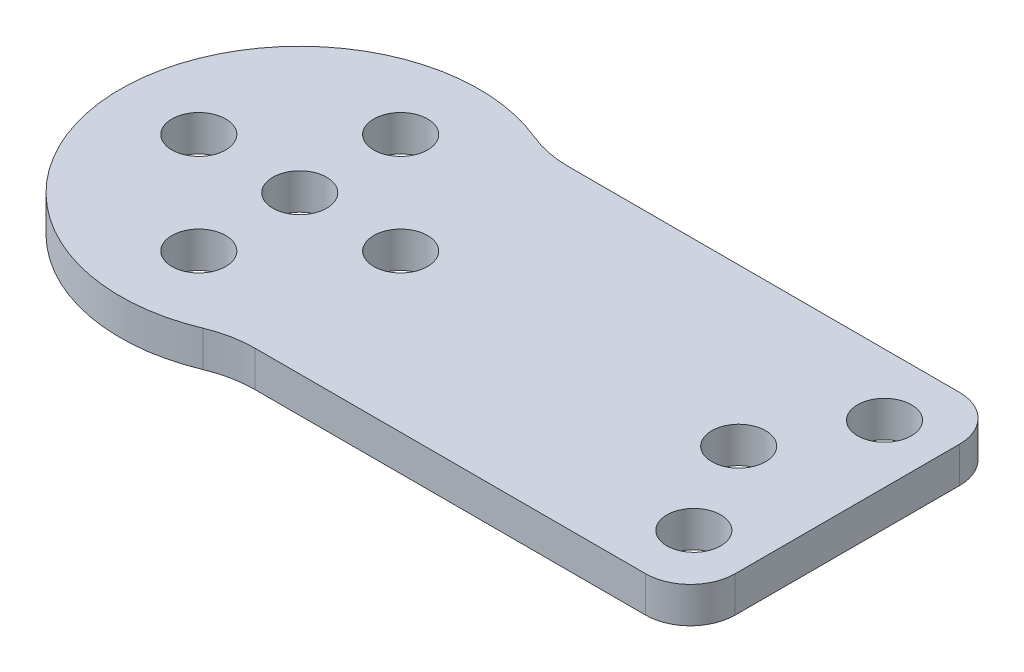
ISO-10303-21;
HEADER;
FILE_DESCRIPTION(('STEP AP214'),'2;1');
FILE_NAME('part.step','',(''),(''),'','','');
FILE_SCHEMA(('AUTOMOTIVE_DESIGN { 1 0 10303 214 1 1 1 1 }'));
ENDSEC;
DATA;
#1=APPLICATION_CONTEXT('core data for automotive mechanical design processes');
#2=APPLICATION_PROTOCOL_DEFINITION('international standard','automotive_design',2000,#1);
#3=PRODUCT_CONTEXT('',#1,'mechanical');
#4=PRODUCT('Part','Part','',(#3));
#5=PRODUCT_RELATED_PRODUCT_CATEGORY('part','',(#4));
#6=PRODUCT_DEFINITION_FORMATION('','',#4);
#7=PRODUCT_DEFINITION_CONTEXT('part definition',#1,'design');
#8=PRODUCT_DEFINITION('design','',#6,#7);
#9=PRODUCT_DEFINITION_SHAPE('','',#8);
#10=(LENGTH_UNIT() NAMED_UNIT(*) SI_UNIT(.MILLI.,.METRE.));
#11=(NAMED_UNIT(*) PLANE_ANGLE_UNIT() SI_UNIT($,.RADIAN.));
#12=(NAMED_UNIT(*) SI_UNIT($,.STERADIAN.) SOLID_ANGLE_UNIT());
#13=UNCERTAINTY_MEASURE_WITH_UNIT(LENGTH_MEASURE(1.E-05),#10,'distance_accuracy_value','');
#14=(GEOMETRIC_REPRESENTATION_CONTEXT(3) GLOBAL_UNCERTAINTY_ASSIGNED_CONTEXT((#13)) GLOBAL_UNIT_ASSIGNED_CONTEXT((#10,
#11,#12)) REPRESENTATION_CONTEXT('',''));
#15=CARTESIAN_POINT('',(0.,0.,0.));
#16=DIRECTION('',(0.,0.,1.));
#17=DIRECTION('',(1.,0.,0.));
#18=AXIS2_PLACEMENT_3D('',#15,#16,#17);
#19=CARTESIAN_POINT('',(11.716387939251,0.8,7.));
#20=DIRECTION('',(-1.,0.,0.));
#21=DIRECTION('',(0.,0.,1.));
#22=AXIS2_PLACEMENT_3D('',#19,#20,#21);
#23=PLANE('',#22);
#24=DIRECTION('',(0.,0.,-1.));
#25=VECTOR('',#24,1.);
#26=CARTESIAN_POINT('',(11.716387939251,-0.8,7.));
#27=LINE('',#26,#25);
#28=CARTESIAN_POINT('',(11.716387939251,-0.8,5.));
#29=VERTEX_POINT('',#28);
#30=CARTESIAN_POINT('',(11.716387939251,-0.8,-5.));
#31=VERTEX_POINT('',#30);
#32=EDGE_CURVE('E123',#29,#31,#27,.T.);
#33=ORIENTED_EDGE('',*,*,#32,.T.);
#34=DIRECTION('',(0.,-1.,0.));
#35=VECTOR('',#34,1.);
#36=CARTESIAN_POINT('',(11.716387939251,0.8,-5.));
#37=LINE('',#36,#35);
#38=CARTESIAN_POINT('',(11.716387939251,0.8,-5.));
#39=VERTEX_POINT('',#38);
#40=EDGE_CURVE('E101',#31,#39,#37,.F.);
#41=ORIENTED_EDGE('',*,*,#40,.T.);
#42=DIRECTION('',(0.,0.,-1.));
#43=VECTOR('',#42,1.);
#44=CARTESIAN_POINT('',(11.716387939251,0.8,7.));
#45=LINE('',#44,#43);
#46=CARTESIAN_POINT('',(11.716387939251,0.8,5.));
#47=VERTEX_POINT('',#46);
#48=EDGE_CURVE('E132',#47,#39,#45,.T.);
#49=ORIENTED_EDGE('',*,*,#48,.F.);
#50=DIRECTION('',(0.,-1.,0.));
#51=VECTOR('',#50,1.);
#52=CARTESIAN_POINT('',(11.716387939251,0.8,5.));
#53=LINE('',#52,#51);
#54=EDGE_CURVE('E106',#47,#29,#53,.T.);
#55=ORIENTED_EDGE('',*,*,#54,.T.);
#56=EDGE_LOOP('',(#33,#41,#49,#55));
#57=FACE_BOUND('',#56,.T.);
#58=ADVANCED_FACE('F32',(#57),#23,.F.);
#59=CARTESIAN_POINT('',(11.716387939251,0.8,-7.));
#60=DIRECTION('',(0.,0.,1.));
#61=DIRECTION('',(1.,0.,0.));
#62=AXIS2_PLACEMENT_3D('',#59,#60,#61);
#63=PLANE('',#62);
#64=DIRECTION('',(-1.,0.,0.));
#65=VECTOR('',#64,1.);
#66=CARTESIAN_POINT('',(11.716387939251,-0.8,-7.));
#67=LINE('',#66,#65);
#68=CARTESIAN_POINT('',(9.71638793925096,-0.8,-7.));
#69=VERTEX_POINT('',#68);
#70=CARTESIAN_POINT('',(-7.7,-0.8,-7.));
#71=VERTEX_POINT('',#70);
#72=EDGE_CURVE('E113',#69,#71,#67,.T.);
#73=ORIENTED_EDGE('',*,*,#72,.T.);
#74=DIRECTION('',(0.,1.,0.));
#75=VECTOR('',#74,1.);
#76=CARTESIAN_POINT('',(-7.7,0.8,-7.));
#77=LINE('',#76,#75);
#78=CARTESIAN_POINT('',(-7.7,0.8,-7.));
#79=VERTEX_POINT('',#78);
#80=EDGE_CURVE('E151',#71,#79,#77,.T.);
#81=ORIENTED_EDGE('',*,*,#80,.T.);
#82=DIRECTION('',(-1.,0.,0.));
#83=VECTOR('',#82,1.);
#84=CARTESIAN_POINT('',(11.716387939251,0.8,-7.));
#85=LINE('',#84,#83);
#86=CARTESIAN_POINT('',(9.71638793925096,0.8,-7.));
#87=VERTEX_POINT('',#86);
#88=EDGE_CURVE('E116',#87,#79,#85,.T.);
#89=ORIENTED_EDGE('',*,*,#88,.F.);
#90=DIRECTION('',(0.,-1.,0.));
#91=VECTOR('',#90,1.);
#92=CARTESIAN_POINT('',(9.71638793925096,0.8,-7.));
#93=LINE('',#92,#91);
#94=EDGE_CURVE('E100',#87,#69,#93,.T.);
#95=ORIENTED_EDGE('',*,*,#94,.T.);
#96=EDGE_LOOP('',(#73,#81,#89,#95));
#97=FACE_BOUND('',#96,.T.);
#98=ADVANCED_FACE('F112',(#97),#63,.F.);
#99=CARTESIAN_POINT('',(-12.7,0.8,0.));
#100=DIRECTION('',(0.,-1.,0.));
#101=DIRECTION('',(0.,0.,-1.));
#102=AXIS2_PLACEMENT_3D('',#99,#100,#101);
#103=CYLINDRICAL_SURFACE('',#102,8.);
#104=CARTESIAN_POINT('',(-12.7,0.8,0.));
#105=DIRECTION('',(0.,1.,0.));
#106=DIRECTION('',(0.,0.,1.));
#107=AXIS2_PLACEMENT_3D('',#104,#105,#106);
#108=CIRCLE('',#107,8.);
#109=CARTESIAN_POINT('',(-9.62307692307692,0.8,-7.38461538461539));
#110=VERTEX_POINT('',#109);
#111=CARTESIAN_POINT('',(-9.62307692307694,0.8,7.38461538461538));
#112=VERTEX_POINT('',#111);
#113=EDGE_CURVE('E166',#110,#112,#108,.T.);
#114=ORIENTED_EDGE('',*,*,#113,.F.);
#115=DIRECTION('',(0.,-1.,0.));
#116=VECTOR('',#115,1.);
#117=CARTESIAN_POINT('',(-9.62307692307692,0.8,-7.38461538461539));
#118=LINE('',#117,#116);
#119=CARTESIAN_POINT('',(-9.62307692307692,-0.8,-7.38461538461539));
#120=VERTEX_POINT('',#119);
#121=EDGE_CURVE('E148',#110,#120,#118,.T.);
#122=ORIENTED_EDGE('',*,*,#121,.T.);
#123=CARTESIAN_POINT('',(-12.7,-0.8,0.));
#124=DIRECTION('',(0.,1.,0.));
#125=DIRECTION('',(0.,0.,1.));
#126=AXIS2_PLACEMENT_3D('',#123,#124,#125);
#127=CIRCLE('',#126,8.);
#128=CARTESIAN_POINT('',(-9.62307692307694,-0.8,7.38461538461538));
#129=VERTEX_POINT('',#128);
#130=EDGE_CURVE('E122',#120,#129,#127,.T.);
#131=ORIENTED_EDGE('',*,*,#130,.T.);
#132=DIRECTION('',(0.,-1.,0.));
#133=VECTOR('',#132,1.);
#134=CARTESIAN_POINT('',(-9.62307692307694,0.8,7.38461538461538));
#135=LINE('',#134,#133);
#136=EDGE_CURVE('E146',#129,#112,#135,.F.);
#137=ORIENTED_EDGE('',*,*,#136,.T.);
#138=EDGE_LOOP('',(#114,#122,#131,#137));
#139=FACE_BOUND('',#138,.T.);
#140=ADVANCED_FACE('F160',(#139),#103,.T.);
#141=CARTESIAN_POINT('',(-8.8270166537926,0.8,7.));
#142=DIRECTION('',(0.,0.,-1.));
#143=DIRECTION('',(-1.,0.,0.));
#144=AXIS2_PLACEMENT_3D('',#141,#142,#143);
#145=PLANE('',#144);
#146=DIRECTION('',(1.,0.,0.));
#147=VECTOR('',#146,1.);
#148=CARTESIAN_POINT('',(-8.8270166537926,0.8,7.));
#149=LINE('',#148,#147);
#150=CARTESIAN_POINT('',(-7.70000000000002,0.8,7.));
#151=VERTEX_POINT('',#150);
#152=CARTESIAN_POINT('',(9.71638793925096,0.8,7.));
#153=VERTEX_POINT('',#152);
#154=EDGE_CURVE('E117',#151,#153,#149,.T.);
#155=ORIENTED_EDGE('',*,*,#154,.F.);
#156=DIRECTION('',(0.,1.,0.));
#157=VECTOR('',#156,1.);
#158=CARTESIAN_POINT('',(-7.70000000000002,-0.8,7.));
#159=LINE('',#158,#157);
#160=CARTESIAN_POINT('',(-7.70000000000002,-0.8,7.));
#161=VERTEX_POINT('',#160);
#162=EDGE_CURVE('E153',#151,#161,#159,.F.);
#163=ORIENTED_EDGE('',*,*,#162,.T.);
#164=DIRECTION('',(1.,0.,0.));
#165=VECTOR('',#164,1.);
#166=CARTESIAN_POINT('',(-8.8270166537926,-0.8,7.));
#167=LINE('',#166,#165);
#168=CARTESIAN_POINT('',(9.71638793925096,-0.8,7.));
#169=VERTEX_POINT('',#168);
#170=EDGE_CURVE('E126',#161,#169,#167,.T.);
#171=ORIENTED_EDGE('',*,*,#170,.T.);
#172=DIRECTION('',(0.,-1.,0.));
#173=VECTOR('',#172,1.);
#174=CARTESIAN_POINT('',(9.71638793925096,0.8,7.));
#175=LINE('',#174,#173);
#176=EDGE_CURVE('E143',#169,#153,#175,.F.);
#177=ORIENTED_EDGE('',*,*,#176,.T.);
#178=EDGE_LOOP('',(#155,#163,#171,#177));
#179=FACE_BOUND('',#178,.T.);
#180=ADVANCED_FACE('F163',(#179),#145,.F.);
#181=CARTESIAN_POINT('',(-12.7,0.8,0.));
#182=DIRECTION('',(0.,1.,0.));
#183=DIRECTION('',(0.,0.,1.));
#184=AXIS2_PLACEMENT_3D('',#181,#182,#183);
#185=PLANE('',#184);
#186=CARTESIAN_POINT('',(9.12138793925096,0.8,-4.25));
#187=DIRECTION('',(0.,1.,0.));
#188=DIRECTION('',(0.,0.,1.));
#189=AXIS2_PLACEMENT_3D('',#186,#187,#188);
#190=CIRCLE('',#189,1.2);
#191=CARTESIAN_POINT('',(9.12138793925096,0.8,-3.05));
#192=VERTEX_POINT('',#191);
#193=EDGE_CURVE('E214',#192,#192,#190,.T.);
#194=ORIENTED_EDGE('',*,*,#193,.F.);
#195=EDGE_LOOP('',(#194));
#196=FACE_BOUND('',#195,.T.);
#197=CARTESIAN_POINT('',(9.12138793925097,0.8,4.25));
#198=DIRECTION('',(0.,1.,0.));
#199=DIRECTION('',(0.,0.,1.));
#200=AXIS2_PLACEMENT_3D('',#197,#198,#199);
#201=CIRCLE('',#200,1.2);
#202=CARTESIAN_POINT('',(9.12138793925097,0.8,5.45));
#203=VERTEX_POINT('',#202);
#204=EDGE_CURVE('E208',#203,#203,#201,.T.);
#205=ORIENTED_EDGE('',*,*,#204,.F.);
#206=EDGE_LOOP('',(#205));
#207=FACE_BOUND('',#206,.T.);
#208=CARTESIAN_POINT('',(6.87138793925096,0.8,0.));
#209=DIRECTION('',(0.,1.,0.));
#210=DIRECTION('',(0.,0.,1.));
#211=AXIS2_PLACEMENT_3D('',#208,#209,#210);
#212=CIRCLE('',#211,1.2);
#213=CARTESIAN_POINT('',(6.87138793925096,0.8,1.2));
#214=VERTEX_POINT('',#213);
#215=EDGE_CURVE('E202',#214,#214,#212,.T.);
#216=ORIENTED_EDGE('',*,*,#215,.F.);
#217=EDGE_LOOP('',(#216));
#218=FACE_BOUND('',#217,.T.);
#219=CARTESIAN_POINT('',(-8.2,0.8,0.));
#220=DIRECTION('',(0.,1.,0.));
#221=DIRECTION('',(0.,0.,1.));
#222=AXIS2_PLACEMENT_3D('',#219,#220,#221);
#223=CIRCLE('',#222,1.2);
#224=CARTESIAN_POINT('',(-8.2,0.8,1.2));
#225=VERTEX_POINT('',#224);
#226=EDGE_CURVE('E185',#225,#225,#223,.T.);
#227=ORIENTED_EDGE('',*,*,#226,.F.);
#228=EDGE_LOOP('',(#227));
#229=FACE_BOUND('',#228,.T.);
#230=CARTESIAN_POINT('',(-12.7,0.8,0.));
#231=DIRECTION('',(0.,1.,0.));
#232=DIRECTION('',(0.,0.,1.));
#233=AXIS2_PLACEMENT_3D('',#230,#231,#232);
#234=CIRCLE('',#233,1.2);
#235=CARTESIAN_POINT('',(-12.7,0.8,1.2));
#236=VERTEX_POINT('',#235);
#237=EDGE_CURVE('E186',#236,#236,#234,.T.);
#238=ORIENTED_EDGE('',*,*,#237,.F.);
#239=EDGE_LOOP('',(#238));
#240=FACE_BOUND('',#239,.T.);
#241=CARTESIAN_POINT('',(-12.7,0.8,4.5));
#242=DIRECTION('',(0.,1.,0.));
#243=DIRECTION('',(0.,0.,1.));
#244=AXIS2_PLACEMENT_3D('',#241,#242,#243);
#245=CIRCLE('',#244,1.2);
#246=CARTESIAN_POINT('',(-12.7,0.8,5.7));
#247=VERTEX_POINT('',#246);
#248=EDGE_CURVE('E193',#247,#247,#245,.T.);
#249=ORIENTED_EDGE('',*,*,#248,.F.);
#250=EDGE_LOOP('',(#249));
#251=FACE_BOUND('',#250,.T.);
#252=CARTESIAN_POINT('',(-17.2,0.8,0.));
#253=DIRECTION('',(0.,1.,0.));
#254=DIRECTION('',(0.,0.,1.));
#255=AXIS2_PLACEMENT_3D('',#252,#253,#254);
#256=CIRCLE('',#255,1.2);
#257=CARTESIAN_POINT('',(-17.2,0.8,1.2));
#258=VERTEX_POINT('',#257);
#259=EDGE_CURVE('E172',#258,#258,#256,.T.);
#260=ORIENTED_EDGE('',*,*,#259,.F.);
#261=EDGE_LOOP('',(#260));
#262=FACE_BOUND('',#261,.T.);
#263=CARTESIAN_POINT('',(-12.7,0.8,-4.5));
#264=DIRECTION('',(0.,1.,0.));
#265=DIRECTION('',(0.,0.,1.));
#266=AXIS2_PLACEMENT_3D('',#263,#264,#265);
#267=CIRCLE('',#266,1.2);
#268=CARTESIAN_POINT('',(-12.7,0.8,-3.3));
#269=VERTEX_POINT('',#268);
#270=EDGE_CURVE('E179',#269,#269,#267,.T.);
#271=ORIENTED_EDGE('',*,*,#270,.F.);
#272=EDGE_LOOP('',(#271));
#273=FACE_BOUND('',#272,.T.);
#274=ORIENTED_EDGE('',*,*,#48,.T.);
#275=CARTESIAN_POINT('',(9.71638793925096,0.8,-5.));
#276=DIRECTION('',(0.,1.,0.));
#277=DIRECTION('',(0.,0.,1.));
#278=AXIS2_PLACEMENT_3D('',#275,#276,#277);
#279=CIRCLE('',#278,2.);
#280=EDGE_CURVE('E141',#39,#87,#279,.T.);
#281=ORIENTED_EDGE('',*,*,#280,.T.);
#282=ORIENTED_EDGE('',*,*,#88,.T.);
#283=CARTESIAN_POINT('',(-7.7,0.8,-12.));
#284=DIRECTION('',(0.,1.,0.));
#285=DIRECTION('',(0.,0.,1.));
#286=AXIS2_PLACEMENT_3D('',#283,#284,#285);
#287=CIRCLE('',#286,5.);
#288=EDGE_CURVE('E156',#79,#110,#287,.F.);
#289=ORIENTED_EDGE('',*,*,#288,.T.);
#290=ORIENTED_EDGE('',*,*,#113,.T.);
#291=CARTESIAN_POINT('',(-7.70000000000002,0.8,12.));
#292=DIRECTION('',(0.,1.,0.));
#293=DIRECTION('',(0.,0.,1.));
#294=AXIS2_PLACEMENT_3D('',#291,#292,#293);
#295=CIRCLE('',#294,5.);
#296=EDGE_CURVE('E11',#112,#151,#295,.F.);
#297=ORIENTED_EDGE('',*,*,#296,.T.);
#298=ORIENTED_EDGE('',*,*,#154,.T.);
#299=CARTESIAN_POINT('',(9.71638793925096,0.8,5.));
#300=DIRECTION('',(0.,1.,0.));
#301=DIRECTION('',(0.,0.,1.));
#302=AXIS2_PLACEMENT_3D('',#299,#300,#301);
#303=CIRCLE('',#302,2.);
#304=EDGE_CURVE('E139',#153,#47,#303,.T.);
#305=ORIENTED_EDGE('',*,*,#304,.T.);
#306=EDGE_LOOP('',(#274,#281,#282,#289,#290,#297,#298,#305));
#307=FACE_BOUND('',#306,.T.);
#308=ADVANCED_FACE('F229',(#196,#207,#218,#229,#240,#251,#262,#273,#307),#185,.T.);
#309=CARTESIAN_POINT('',(-12.7,-0.8,0.));
#310=DIRECTION('',(0.,1.,0.));
#311=DIRECTION('',(0.,0.,1.));
#312=AXIS2_PLACEMENT_3D('',#309,#310,#311);
#313=PLANE('',#312);
#314=CARTESIAN_POINT('',(9.12138793925096,-0.8,-4.25));
#315=DIRECTION('',(0.,1.,0.));
#316=DIRECTION('',(0.,0.,1.));
#317=AXIS2_PLACEMENT_3D('',#314,#315,#316);
#318=CIRCLE('',#317,1.2);
#319=CARTESIAN_POINT('',(9.12138793925096,-0.8,-3.05));
#320=VERTEX_POINT('',#319);
#321=EDGE_CURVE('E190',#320,#320,#318,.T.);
#322=ORIENTED_EDGE('',*,*,#321,.T.);
#323=EDGE_LOOP('',(#322));
#324=FACE_BOUND('',#323,.T.);
#325=CARTESIAN_POINT('',(9.12138793925097,-0.8,4.25));
#326=DIRECTION('',(0.,1.,0.));
#327=DIRECTION('',(0.,0.,1.));
#328=AXIS2_PLACEMENT_3D('',#325,#326,#327);
#329=CIRCLE('',#328,1.2);
#330=CARTESIAN_POINT('',(9.12138793925097,-0.8,5.45));
#331=VERTEX_POINT('',#330);
#332=EDGE_CURVE('E211',#331,#331,#329,.T.);
#333=ORIENTED_EDGE('',*,*,#332,.T.);
#334=EDGE_LOOP('',(#333));
#335=FACE_BOUND('',#334,.T.);
#336=CARTESIAN_POINT('',(6.87138793925096,-0.8,0.));
#337=DIRECTION('',(0.,1.,0.));
#338=DIRECTION('',(0.,0.,1.));
#339=AXIS2_PLACEMENT_3D('',#336,#337,#338);
#340=CIRCLE('',#339,1.2);
#341=CARTESIAN_POINT('',(6.87138793925096,-0.8,1.2));
#342=VERTEX_POINT('',#341);
#343=EDGE_CURVE('E205',#342,#342,#340,.T.);
#344=ORIENTED_EDGE('',*,*,#343,.T.);
#345=EDGE_LOOP('',(#344));
#346=FACE_BOUND('',#345,.T.);
#347=CARTESIAN_POINT('',(-8.2,-0.8,0.));
#348=DIRECTION('',(0.,1.,0.));
#349=DIRECTION('',(0.,0.,1.));
#350=AXIS2_PLACEMENT_3D('',#347,#348,#349);
#351=CIRCLE('',#350,1.2);
#352=CARTESIAN_POINT('',(-8.2,-0.8,1.2));
#353=VERTEX_POINT('',#352);
#354=EDGE_CURVE('E128',#353,#353,#351,.T.);
#355=ORIENTED_EDGE('',*,*,#354,.T.);
#356=EDGE_LOOP('',(#355));
#357=FACE_BOUND('',#356,.T.);
#358=CARTESIAN_POINT('',(-12.7,-0.8,0.));
#359=DIRECTION('',(0.,1.,0.));
#360=DIRECTION('',(0.,0.,1.));
#361=AXIS2_PLACEMENT_3D('',#358,#359,#360);
#362=CIRCLE('',#361,1.2);
#363=CARTESIAN_POINT('',(-12.7,-0.8,1.2));
#364=VERTEX_POINT('',#363);
#365=EDGE_CURVE('E189',#364,#364,#362,.T.);
#366=ORIENTED_EDGE('',*,*,#365,.T.);
#367=EDGE_LOOP('',(#366));
#368=FACE_BOUND('',#367,.T.);
#369=CARTESIAN_POINT('',(-12.7,-0.8,4.5));
#370=DIRECTION('',(0.,1.,0.));
#371=DIRECTION('',(0.,0.,1.));
#372=AXIS2_PLACEMENT_3D('',#369,#370,#371);
#373=CIRCLE('',#372,1.2);
#374=CARTESIAN_POINT('',(-12.7,-0.8,5.7));
#375=VERTEX_POINT('',#374);
#376=EDGE_CURVE('E176',#375,#375,#373,.T.);
#377=ORIENTED_EDGE('',*,*,#376,.T.);
#378=EDGE_LOOP('',(#377));
#379=FACE_BOUND('',#378,.T.);
#380=CARTESIAN_POINT('',(-17.2,-0.8,0.));
#381=DIRECTION('',(0.,1.,0.));
#382=DIRECTION('',(0.,0.,1.));
#383=AXIS2_PLACEMENT_3D('',#380,#381,#382);
#384=CIRCLE('',#383,1.2);
#385=CARTESIAN_POINT('',(-17.2,-0.8,1.2));
#386=VERTEX_POINT('',#385);
#387=EDGE_CURVE('E175',#386,#386,#384,.T.);
#388=ORIENTED_EDGE('',*,*,#387,.T.);
#389=EDGE_LOOP('',(#388));
#390=FACE_BOUND('',#389,.T.);
#391=CARTESIAN_POINT('',(-12.7,-0.8,-4.5));
#392=DIRECTION('',(0.,1.,0.));
#393=DIRECTION('',(0.,0.,1.));
#394=AXIS2_PLACEMENT_3D('',#391,#392,#393);
#395=CIRCLE('',#394,1.2);
#396=CARTESIAN_POINT('',(-12.7,-0.8,-3.3));
#397=VERTEX_POINT('',#396);
#398=EDGE_CURVE('E182',#397,#397,#395,.T.);
#399=ORIENTED_EDGE('',*,*,#398,.T.);
#400=EDGE_LOOP('',(#399));
#401=FACE_BOUND('',#400,.T.);
#402=ORIENTED_EDGE('',*,*,#72,.F.);
#403=CARTESIAN_POINT('',(9.71638793925096,-0.8,-5.));
#404=DIRECTION('',(0.,1.,0.));
#405=DIRECTION('',(0.,0.,1.));
#406=AXIS2_PLACEMENT_3D('',#403,#404,#405);
#407=CIRCLE('',#406,2.);
#408=EDGE_CURVE('E96',#69,#31,#407,.F.);
#409=ORIENTED_EDGE('',*,*,#408,.T.);
#410=ORIENTED_EDGE('',*,*,#32,.F.);
#411=CARTESIAN_POINT('',(9.71638793925096,-0.8,5.));
#412=DIRECTION('',(0.,1.,0.));
#413=DIRECTION('',(0.,0.,1.));
#414=AXIS2_PLACEMENT_3D('',#411,#412,#413);
#415=CIRCLE('',#414,2.);
#416=EDGE_CURVE('E107',#29,#169,#415,.F.);
#417=ORIENTED_EDGE('',*,*,#416,.T.);
#418=ORIENTED_EDGE('',*,*,#170,.F.);
#419=CARTESIAN_POINT('',(-7.70000000000002,-0.8,12.));
#420=DIRECTION('',(0.,1.,0.));
#421=DIRECTION('',(0.,0.,1.));
#422=AXIS2_PLACEMENT_3D('',#419,#420,#421);
#423=CIRCLE('',#422,5.);
#424=EDGE_CURVE('E40',#161,#129,#423,.T.);
#425=ORIENTED_EDGE('',*,*,#424,.T.);
#426=ORIENTED_EDGE('',*,*,#130,.F.);
#427=CARTESIAN_POINT('',(-7.7,-0.8,-12.));
#428=DIRECTION('',(0.,1.,0.));
#429=DIRECTION('',(0.,0.,1.));
#430=AXIS2_PLACEMENT_3D('',#427,#428,#429);
#431=CIRCLE('',#430,5.);
#432=EDGE_CURVE('E121',#120,#71,#431,.T.);
#433=ORIENTED_EDGE('',*,*,#432,.T.);
#434=EDGE_LOOP('',(#402,#409,#410,#417,#418,#425,#426,#433));
#435=FACE_BOUND('',#434,.T.);
#436=ADVANCED_FACE('F119',(#324,#335,#346,#357,#368,#379,#390,#401,#435),#313,.F.);
#437=CARTESIAN_POINT('',(9.71638793925096,0.8,-5.));
#438=DIRECTION('',(0.,-1.,0.));
#439=DIRECTION('',(0.,0.,-1.));
#440=AXIS2_PLACEMENT_3D('',#437,#438,#439);
#441=CYLINDRICAL_SURFACE('',#440,2.);
#442=ORIENTED_EDGE('',*,*,#280,.F.);
#443=ORIENTED_EDGE('',*,*,#40,.F.);
#444=ORIENTED_EDGE('',*,*,#408,.F.);
#445=ORIENTED_EDGE('',*,*,#94,.F.);
#446=EDGE_LOOP('',(#442,#443,#444,#445));
#447=FACE_BOUND('',#446,.T.);
#448=ADVANCED_FACE('F99',(#447),#441,.T.);
#449=CARTESIAN_POINT('',(9.71638793925096,0.8,5.));
#450=DIRECTION('',(0.,-1.,0.));
#451=DIRECTION('',(0.,0.,-1.));
#452=AXIS2_PLACEMENT_3D('',#449,#450,#451);
#453=CYLINDRICAL_SURFACE('',#452,2.);
#454=ORIENTED_EDGE('',*,*,#304,.F.);
#455=ORIENTED_EDGE('',*,*,#176,.F.);
#456=ORIENTED_EDGE('',*,*,#416,.F.);
#457=ORIENTED_EDGE('',*,*,#54,.F.);
#458=EDGE_LOOP('',(#454,#455,#456,#457));
#459=FACE_BOUND('',#458,.T.);
#460=ADVANCED_FACE('F250',(#459),#453,.T.);
#461=CARTESIAN_POINT('',(-7.7,0.8,-12.));
#462=DIRECTION('',(0.,-1.,0.));
#463=DIRECTION('',(0.,0.,-1.));
#464=AXIS2_PLACEMENT_3D('',#461,#462,#463);
#465=CYLINDRICAL_SURFACE('',#464,5.);
#466=ORIENTED_EDGE('',*,*,#288,.F.);
#467=ORIENTED_EDGE('',*,*,#80,.F.);
#468=ORIENTED_EDGE('',*,*,#432,.F.);
#469=ORIENTED_EDGE('',*,*,#121,.F.);
#470=EDGE_LOOP('',(#466,#467,#468,#469));
#471=FACE_BOUND('',#470,.T.);
#472=ADVANCED_FACE('F252',(#471),#465,.F.);
#473=CARTESIAN_POINT('',(-7.70000000000002,0.8,12.));
#474=DIRECTION('',(0.,-1.,0.));
#475=DIRECTION('',(0.,0.,-1.));
#476=AXIS2_PLACEMENT_3D('',#473,#474,#475);
#477=CYLINDRICAL_SURFACE('',#476,5.);
#478=ORIENTED_EDGE('',*,*,#296,.F.);
#479=ORIENTED_EDGE('',*,*,#136,.F.);
#480=ORIENTED_EDGE('',*,*,#424,.F.);
#481=ORIENTED_EDGE('',*,*,#162,.F.);
#482=EDGE_LOOP('',(#478,#479,#480,#481));
#483=FACE_BOUND('',#482,.T.);
#484=ADVANCED_FACE('F34',(#483),#477,.F.);
#485=CARTESIAN_POINT('',(-12.7,-0.8,-4.5));
#486=DIRECTION('',(0.,1.,0.));
#487=DIRECTION('',(0.,0.,1.));
#488=AXIS2_PLACEMENT_3D('',#485,#486,#487);
#489=CYLINDRICAL_SURFACE('',#488,1.2);
#490=ORIENTED_EDGE('',*,*,#398,.F.);
#491=EDGE_LOOP('',(#490));
#492=FACE_BOUND('',#491,.T.);
#493=ORIENTED_EDGE('',*,*,#270,.T.);
#494=EDGE_LOOP('',(#493));
#495=FACE_BOUND('',#494,.T.);
#496=ADVANCED_FACE('F277',(#492,#495),#489,.F.);
#497=CARTESIAN_POINT('',(-17.2,-0.8,0.));
#498=DIRECTION('',(0.,1.,0.));
#499=DIRECTION('',(0.,0.,1.));
#500=AXIS2_PLACEMENT_3D('',#497,#498,#499);
#501=CYLINDRICAL_SURFACE('',#500,1.2);
#502=ORIENTED_EDGE('',*,*,#387,.F.);
#503=EDGE_LOOP('',(#502));
#504=FACE_BOUND('',#503,.T.);
#505=ORIENTED_EDGE('',*,*,#259,.T.);
#506=EDGE_LOOP('',(#505));
#507=FACE_BOUND('',#506,.T.);
#508=ADVANCED_FACE('F273',(#504,#507),#501,.F.);
#509=CARTESIAN_POINT('',(-12.7,-0.8,4.5));
#510=DIRECTION('',(0.,1.,0.));
#511=DIRECTION('',(0.,0.,1.));
#512=AXIS2_PLACEMENT_3D('',#509,#510,#511);
#513=CYLINDRICAL_SURFACE('',#512,1.2);
#514=ORIENTED_EDGE('',*,*,#376,.F.);
#515=EDGE_LOOP('',(#514));
#516=FACE_BOUND('',#515,.T.);
#517=ORIENTED_EDGE('',*,*,#248,.T.);
#518=EDGE_LOOP('',(#517));
#519=FACE_BOUND('',#518,.T.);
#520=ADVANCED_FACE('F276',(#516,#519),#513,.F.);
#521=CARTESIAN_POINT('',(-12.7,-0.8,0.));
#522=DIRECTION('',(0.,1.,0.));
#523=DIRECTION('',(0.,0.,1.));
#524=AXIS2_PLACEMENT_3D('',#521,#522,#523);
#525=CYLINDRICAL_SURFACE('',#524,1.2);
#526=ORIENTED_EDGE('',*,*,#365,.F.);
#527=EDGE_LOOP('',(#526));
#528=FACE_BOUND('',#527,.T.);
#529=ORIENTED_EDGE('',*,*,#237,.T.);
#530=EDGE_LOOP('',(#529));
#531=FACE_BOUND('',#530,.T.);
#532=ADVANCED_FACE('F282',(#528,#531),#525,.F.);
#533=CARTESIAN_POINT('',(-8.2,-0.8,0.));
#534=DIRECTION('',(0.,1.,0.));
#535=DIRECTION('',(0.,0.,1.));
#536=AXIS2_PLACEMENT_3D('',#533,#534,#535);
#537=CYLINDRICAL_SURFACE('',#536,1.2);
#538=ORIENTED_EDGE('',*,*,#354,.F.);
#539=EDGE_LOOP('',(#538));
#540=FACE_BOUND('',#539,.T.);
#541=ORIENTED_EDGE('',*,*,#226,.T.);
#542=EDGE_LOOP('',(#541));
#543=FACE_BOUND('',#542,.T.);
#544=ADVANCED_FACE('F285',(#540,#543),#537,.F.);
#545=CARTESIAN_POINT('',(6.87138793925096,-0.8,0.));
#546=DIRECTION('',(0.,1.,0.));
#547=DIRECTION('',(0.,0.,1.));
#548=AXIS2_PLACEMENT_3D('',#545,#546,#547);
#549=CYLINDRICAL_SURFACE('',#548,1.2);
#550=ORIENTED_EDGE('',*,*,#343,.F.);
#551=EDGE_LOOP('',(#550));
#552=FACE_BOUND('',#551,.T.);
#553=ORIENTED_EDGE('',*,*,#215,.T.);
#554=EDGE_LOOP('',(#553));
#555=FACE_BOUND('',#554,.T.);
#556=ADVANCED_FACE('F292',(#552,#555),#549,.F.);
#557=CARTESIAN_POINT('',(9.12138793925097,-0.8,4.25));
#558=DIRECTION('',(0.,1.,0.));
#559=DIRECTION('',(0.,0.,1.));
#560=AXIS2_PLACEMENT_3D('',#557,#558,#559);
#561=CYLINDRICAL_SURFACE('',#560,1.2);
#562=ORIENTED_EDGE('',*,*,#332,.F.);
#563=EDGE_LOOP('',(#562));
#564=FACE_BOUND('',#563,.T.);
#565=ORIENTED_EDGE('',*,*,#204,.T.);
#566=EDGE_LOOP('',(#565));
#567=FACE_BOUND('',#566,.T.);
#568=ADVANCED_FACE('F225',(#564,#567),#561,.F.);
#569=CARTESIAN_POINT('',(9.12138793925096,-0.8,-4.25));
#570=DIRECTION('',(0.,1.,0.));
#571=DIRECTION('',(0.,0.,1.));
#572=AXIS2_PLACEMENT_3D('',#569,#570,#571);
#573=CYLINDRICAL_SURFACE('',#572,1.2);
#574=ORIENTED_EDGE('',*,*,#321,.F.);
#575=EDGE_LOOP('',(#574));
#576=FACE_BOUND('',#575,.T.);
#577=ORIENTED_EDGE('',*,*,#193,.T.);
#578=EDGE_LOOP('',(#577));
#579=FACE_BOUND('',#578,.T.);
#580=ADVANCED_FACE('F222',(#576,#579),#573,.F.);
#581=CLOSED_SHELL('',(#58,#98,#140,#180,#308,#436,#448,#460,#472,#484,#496,#508,#520,#532,#544,
#556,#568,#580));
#582=MANIFOLD_SOLID_BREP('B2',#581);
#583=ADVANCED_BREP_SHAPE_REPRESENTATION('',(#18,#582),#14);
#584=SHAPE_DEFINITION_REPRESENTATION(#9,#583);
ENDSEC;
END-ISO-10303-21;
